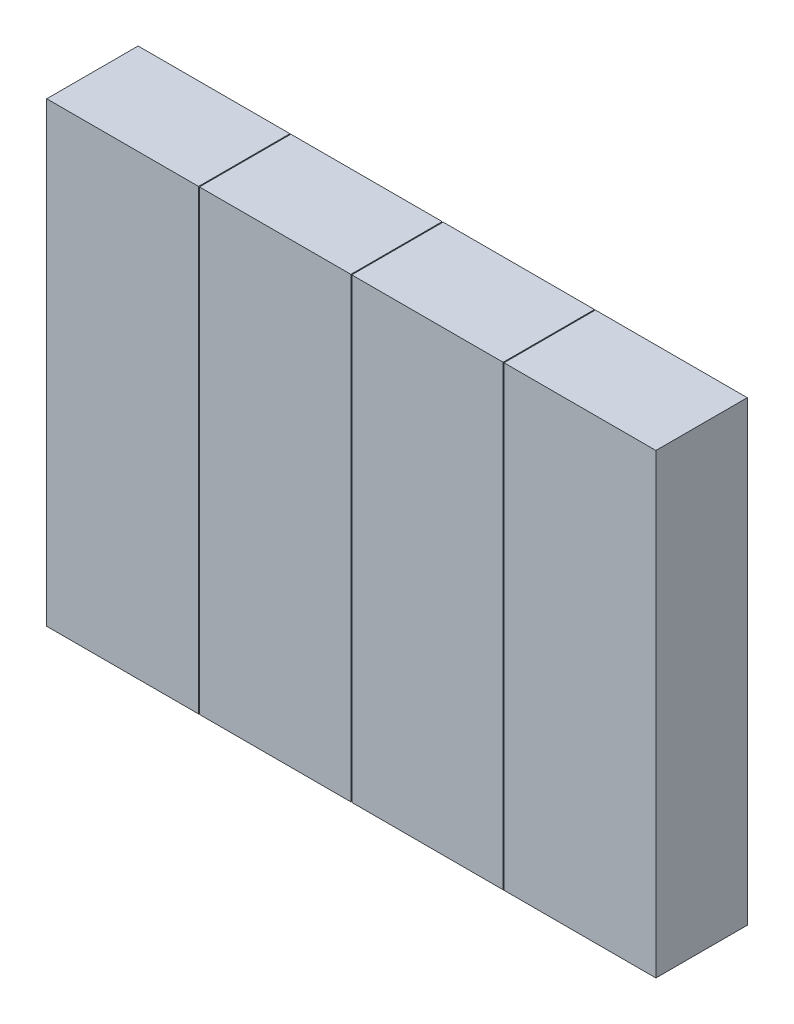
ISO-10303-21;
HEADER;
FILE_DESCRIPTION(('STEP AP214'),'2;1');
FILE_NAME('part.step','',(''),(''),'','','');
FILE_SCHEMA(('AUTOMOTIVE_DESIGN { 1 0 10303 214 1 1 1 1 }'));
ENDSEC;
DATA;
#1=APPLICATION_CONTEXT('core data for automotive mechanical design processes');
#2=APPLICATION_PROTOCOL_DEFINITION('international standard','automotive_design',2000,#1);
#3=PRODUCT_CONTEXT('',#1,'mechanical');
#4=PRODUCT('Part','Part','',(#3));
#5=PRODUCT_RELATED_PRODUCT_CATEGORY('part','',(#4));
#6=PRODUCT_DEFINITION_FORMATION('','',#4);
#7=PRODUCT_DEFINITION_CONTEXT('part definition',#1,'design');
#8=PRODUCT_DEFINITION('design','',#6,#7);
#9=PRODUCT_DEFINITION_SHAPE('','',#8);
#10=(LENGTH_UNIT() NAMED_UNIT(*) SI_UNIT(.MILLI.,.METRE.));
#11=(NAMED_UNIT(*) PLANE_ANGLE_UNIT() SI_UNIT($,.RADIAN.));
#12=(NAMED_UNIT(*) SI_UNIT($,.STERADIAN.) SOLID_ANGLE_UNIT());
#13=UNCERTAINTY_MEASURE_WITH_UNIT(LENGTH_MEASURE(1.E-05),#10,'distance_accuracy_value','');
#14=(GEOMETRIC_REPRESENTATION_CONTEXT(3) GLOBAL_UNCERTAINTY_ASSIGNED_CONTEXT((#13)) GLOBAL_UNIT_ASSIGNED_CONTEXT((#10,
#11,#12)) REPRESENTATION_CONTEXT('',''));
#15=CARTESIAN_POINT('',(0.,0.,0.));
#16=DIRECTION('',(0.,0.,1.));
#17=DIRECTION('',(1.,0.,0.));
#18=AXIS2_PLACEMENT_3D('',#15,#16,#17);
#19=CARTESIAN_POINT('',(83.3370936339227,307.82130846245,30.));
#20=DIRECTION('',(0.,-1.,0.));
#21=DIRECTION('',(0.,0.,-1.));
#22=AXIS2_PLACEMENT_3D('',#19,#20,#21);
#23=PLANE('',#22);
#24=DIRECTION('',(-1.,0.,0.));
#25=VECTOR('',#24,1.);
#26=CARTESIAN_POINT('',(83.3370936339227,307.82130846245,30.));
#27=LINE('',#26,#25);
#28=CARTESIAN_POINT('',(-66.8129063660773,307.82130846245,30.));
#29=VERTEX_POINT('',#28);
#30=CARTESIAN_POINT('',(-116.662906366077,307.82130846245,30.));
#31=VERTEX_POINT('',#30);
#32=EDGE_CURVE('E100',#29,#31,#27,.T.);
#33=ORIENTED_EDGE('',*,*,#32,.F.);
#34=DIRECTION('',(0.,0.,1.));
#35=VECTOR('',#34,1.);
#36=CARTESIAN_POINT('',(-66.8129063660773,307.82130846245,0.));
#37=LINE('',#36,#35);
#38=CARTESIAN_POINT('',(-66.8129063660773,307.82130846245,0.));
#39=VERTEX_POINT('',#38);
#40=EDGE_CURVE('E12',#39,#29,#37,.T.);
#41=ORIENTED_EDGE('',*,*,#40,.F.);
#42=DIRECTION('',(-1.,0.,0.));
#43=VECTOR('',#42,1.);
#44=CARTESIAN_POINT('',(83.3370936339227,307.82130846245,0.));
#45=LINE('',#44,#43);
#46=CARTESIAN_POINT('',(-116.662906366077,307.82130846245,0.));
#47=VERTEX_POINT('',#46);
#48=EDGE_CURVE('E96',#39,#47,#45,.T.);
#49=ORIENTED_EDGE('',*,*,#48,.T.);
#50=DIRECTION('',(0.,0.,-1.));
#51=VECTOR('',#50,1.);
#52=CARTESIAN_POINT('',(-116.662906366077,307.82130846245,30.));
#53=LINE('',#52,#51);
#54=EDGE_CURVE('E107',#31,#47,#53,.T.);
#55=ORIENTED_EDGE('',*,*,#54,.F.);
#56=EDGE_LOOP('',(#33,#41,#49,#55));
#57=FACE_BOUND('',#56,.T.);
#58=ADVANCED_FACE('F53',(#57),#23,.F.);
#59=CARTESIAN_POINT('',(83.3370936339227,157.82130846245,30.));
#60=DIRECTION('',(0.,1.,0.));
#61=DIRECTION('',(0.,0.,1.));
#62=AXIS2_PLACEMENT_3D('',#59,#60,#61);
#63=PLANE('',#62);
#64=DIRECTION('',(1.,0.,0.));
#65=VECTOR('',#64,1.);
#66=CARTESIAN_POINT('',(83.3370936339227,157.82130846245,0.));
#67=LINE('',#66,#65);
#68=CARTESIAN_POINT('',(-116.662906366077,157.82130846245,0.));
#69=VERTEX_POINT('',#68);
#70=CARTESIAN_POINT('',(-66.8129063660773,157.82130846245,0.));
#71=VERTEX_POINT('',#70);
#72=EDGE_CURVE('E121',#69,#71,#67,.T.);
#73=ORIENTED_EDGE('',*,*,#72,.T.);
#74=DIRECTION('',(0.,0.,1.));
#75=VECTOR('',#74,1.);
#76=CARTESIAN_POINT('',(-66.8129063660773,157.82130846245,0.));
#77=LINE('',#76,#75);
#78=CARTESIAN_POINT('',(-66.8129063660773,157.82130846245,30.));
#79=VERTEX_POINT('',#78);
#80=EDGE_CURVE('E119',#71,#79,#77,.T.);
#81=ORIENTED_EDGE('',*,*,#80,.T.);
#82=DIRECTION('',(1.,0.,0.));
#83=VECTOR('',#82,1.);
#84=CARTESIAN_POINT('',(83.3370936339227,157.82130846245,30.));
#85=LINE('',#84,#83);
#86=CARTESIAN_POINT('',(-116.662906366077,157.82130846245,30.));
#87=VERTEX_POINT('',#86);
#88=EDGE_CURVE('E56',#87,#79,#85,.T.);
#89=ORIENTED_EDGE('',*,*,#88,.F.);
#90=DIRECTION('',(0.,0.,-1.));
#91=VECTOR('',#90,1.);
#92=CARTESIAN_POINT('',(-116.662906366077,157.82130846245,30.));
#93=LINE('',#92,#91);
#94=EDGE_CURVE('E106',#87,#69,#93,.T.);
#95=ORIENTED_EDGE('',*,*,#94,.T.);
#96=EDGE_LOOP('',(#73,#81,#89,#95));
#97=FACE_BOUND('',#96,.T.);
#98=ADVANCED_FACE('F134',(#97),#63,.F.);
#99=CARTESIAN_POINT('',(0.,0.,30.));
#100=DIRECTION('',(0.,0.,1.));
#101=DIRECTION('',(1.,0.,0.));
#102=AXIS2_PLACEMENT_3D('',#99,#100,#101);
#103=PLANE('',#102);
#104=DIRECTION('',(0.,-1.,0.));
#105=VECTOR('',#104,1.);
#106=CARTESIAN_POINT('',(-66.8129063660773,307.82130846245,30.));
#107=LINE('',#106,#105);
#108=EDGE_CURVE('E63',#29,#79,#107,.T.);
#109=ORIENTED_EDGE('',*,*,#108,.F.);
#110=ORIENTED_EDGE('',*,*,#32,.T.);
#111=DIRECTION('',(0.,-1.,0.));
#112=VECTOR('',#111,1.);
#113=CARTESIAN_POINT('',(-116.662906366077,157.82130846245,30.));
#114=LINE('',#113,#112);
#115=EDGE_CURVE('E104',#31,#87,#114,.T.);
#116=ORIENTED_EDGE('',*,*,#115,.T.);
#117=ORIENTED_EDGE('',*,*,#88,.T.);
#118=EDGE_LOOP('',(#109,#110,#116,#117));
#119=FACE_BOUND('',#118,.T.);
#120=ADVANCED_FACE('F101',(#119),#103,.T.);
#121=CARTESIAN_POINT('',(0.,0.,0.));
#122=DIRECTION('',(0.,0.,1.));
#123=DIRECTION('',(1.,0.,0.));
#124=AXIS2_PLACEMENT_3D('',#121,#122,#123);
#125=PLANE('',#124);
#126=ORIENTED_EDGE('',*,*,#48,.F.);
#127=DIRECTION('',(0.,-1.,0.));
#128=VECTOR('',#127,1.);
#129=CARTESIAN_POINT('',(-66.8129063660773,307.82130846245,0.));
#130=LINE('',#129,#128);
#131=EDGE_CURVE('E115',#39,#71,#130,.T.);
#132=ORIENTED_EDGE('',*,*,#131,.T.);
#133=ORIENTED_EDGE('',*,*,#72,.F.);
#134=DIRECTION('',(0.,-1.,0.));
#135=VECTOR('',#134,1.);
#136=CARTESIAN_POINT('',(-116.662906366077,157.82130846245,0.));
#137=LINE('',#136,#135);
#138=EDGE_CURVE('E87',#47,#69,#137,.T.);
#139=ORIENTED_EDGE('',*,*,#138,.F.);
#140=EDGE_LOOP('',(#126,#132,#133,#139));
#141=FACE_BOUND('',#140,.T.);
#142=ADVANCED_FACE('F136',(#141),#125,.F.);
#143=CARTESIAN_POINT('',(-116.662906366077,157.82130846245,30.));
#144=DIRECTION('',(1.,0.,0.));
#145=DIRECTION('',(0.,0.,-1.));
#146=AXIS2_PLACEMENT_3D('',#143,#144,#145);
#147=PLANE('',#146);
#148=ORIENTED_EDGE('',*,*,#138,.T.);
#149=ORIENTED_EDGE('',*,*,#94,.F.);
#150=ORIENTED_EDGE('',*,*,#115,.F.);
#151=ORIENTED_EDGE('',*,*,#54,.T.);
#152=EDGE_LOOP('',(#148,#149,#150,#151));
#153=FACE_BOUND('',#152,.T.);
#154=ADVANCED_FACE('F110',(#153),#147,.F.);
#155=CARTESIAN_POINT('',(-66.8129063660773,307.82130846245,0.));
#156=DIRECTION('',(-1.,0.,0.));
#157=DIRECTION('',(0.,-1.,0.));
#158=AXIS2_PLACEMENT_3D('',#155,#156,#157);
#159=PLANE('',#158);
#160=ORIENTED_EDGE('',*,*,#108,.T.);
#161=ORIENTED_EDGE('',*,*,#80,.F.);
#162=ORIENTED_EDGE('',*,*,#131,.F.);
#163=ORIENTED_EDGE('',*,*,#40,.T.);
#164=EDGE_LOOP('',(#160,#161,#162,#163));
#165=FACE_BOUND('',#164,.T.);
#166=ADVANCED_FACE('F137',(#165),#159,.F.);
#167=CLOSED_SHELL('',(#58,#98,#120,#142,#154,#166));
#168=MANIFOLD_SOLID_BREP('B2',#167);
#169=CARTESIAN_POINT('',(0.,0.,0.));
#170=DIRECTION('',(0.,0.,1.));
#171=DIRECTION('',(1.,0.,0.));
#172=AXIS2_PLACEMENT_3D('',#169,#170,#171);
#173=PLANE('',#172);
#174=DIRECTION('',(1.,0.,0.));
#175=VECTOR('',#174,1.);
#176=CARTESIAN_POINT('',(83.3370936339227,157.82130846245,0.));
#177=LINE('',#176,#175);
#178=CARTESIAN_POINT('',(-16.5129063660773,157.82130846245,0.));
#179=VERTEX_POINT('',#178);
#180=CARTESIAN_POINT('',(33.1870936339227,157.82130846245,0.));
#181=VERTEX_POINT('',#180);
#182=EDGE_CURVE('E265',#179,#181,#177,.T.);
#183=ORIENTED_EDGE('',*,*,#182,.F.);
#184=DIRECTION('',(0.,1.,0.));
#185=VECTOR('',#184,1.);
#186=CARTESIAN_POINT('',(-16.5129063660773,307.82130846245,0.));
#187=LINE('',#186,#185);
#188=CARTESIAN_POINT('',(-16.5129063660773,307.82130846245,0.));
#189=VERTEX_POINT('',#188);
#190=EDGE_CURVE('E272',#179,#189,#187,.T.);
#191=ORIENTED_EDGE('',*,*,#190,.T.);
#192=DIRECTION('',(-1.,0.,0.));
#193=VECTOR('',#192,1.);
#194=CARTESIAN_POINT('',(83.3370936339227,307.82130846245,0.));
#195=LINE('',#194,#193);
#196=CARTESIAN_POINT('',(33.1870936339227,307.82130846245,0.));
#197=VERTEX_POINT('',#196);
#198=EDGE_CURVE('E260',#197,#189,#195,.T.);
#199=ORIENTED_EDGE('',*,*,#198,.F.);
#200=DIRECTION('',(0.,-1.,0.));
#201=VECTOR('',#200,1.);
#202=CARTESIAN_POINT('',(33.1870936339227,307.82130846245,0.));
#203=LINE('',#202,#201);
#204=EDGE_CURVE('E269',#197,#181,#203,.T.);
#205=ORIENTED_EDGE('',*,*,#204,.T.);
#206=EDGE_LOOP('',(#183,#191,#199,#205));
#207=FACE_BOUND('',#206,.T.);
#208=ADVANCED_FACE('F210',(#207),#173,.F.);
#209=CARTESIAN_POINT('',(0.,0.,30.));
#210=DIRECTION('',(0.,0.,1.));
#211=DIRECTION('',(1.,0.,0.));
#212=AXIS2_PLACEMENT_3D('',#209,#210,#211);
#213=PLANE('',#212);
#214=DIRECTION('',(0.,1.,0.));
#215=VECTOR('',#214,1.);
#216=CARTESIAN_POINT('',(-16.5129063660773,307.82130846245,30.));
#217=LINE('',#216,#215);
#218=CARTESIAN_POINT('',(-16.5129063660773,157.82130846245,30.));
#219=VERTEX_POINT('',#218);
#220=CARTESIAN_POINT('',(-16.5129063660773,307.82130846245,30.));
#221=VERTEX_POINT('',#220);
#222=EDGE_CURVE('E220',#219,#221,#217,.T.);
#223=ORIENTED_EDGE('',*,*,#222,.F.);
#224=DIRECTION('',(1.,0.,0.));
#225=VECTOR('',#224,1.);
#226=CARTESIAN_POINT('',(83.3370936339227,157.82130846245,30.));
#227=LINE('',#226,#225);
#228=CARTESIAN_POINT('',(33.1870936339227,157.82130846245,30.));
#229=VERTEX_POINT('',#228);
#230=EDGE_CURVE('E214',#219,#229,#227,.T.);
#231=ORIENTED_EDGE('',*,*,#230,.T.);
#232=DIRECTION('',(0.,-1.,0.));
#233=VECTOR('',#232,1.);
#234=CARTESIAN_POINT('',(33.1870936339227,307.82130846245,30.));
#235=LINE('',#234,#233);
#236=CARTESIAN_POINT('',(33.1870936339227,307.82130846245,30.));
#237=VERTEX_POINT('',#236);
#238=EDGE_CURVE('E261',#237,#229,#235,.T.);
#239=ORIENTED_EDGE('',*,*,#238,.F.);
#240=DIRECTION('',(-1.,0.,0.));
#241=VECTOR('',#240,1.);
#242=CARTESIAN_POINT('',(83.3370936339227,307.82130846245,30.));
#243=LINE('',#242,#241);
#244=EDGE_CURVE('E258',#237,#221,#243,.T.);
#245=ORIENTED_EDGE('',*,*,#244,.T.);
#246=EDGE_LOOP('',(#223,#231,#239,#245));
#247=FACE_BOUND('',#246,.T.);
#248=ADVANCED_FACE('F264',(#247),#213,.T.);
#249=CARTESIAN_POINT('',(83.3370936339227,157.82130846245,30.));
#250=DIRECTION('',(0.,1.,0.));
#251=DIRECTION('',(0.,0.,1.));
#252=AXIS2_PLACEMENT_3D('',#249,#250,#251);
#253=PLANE('',#252);
#254=ORIENTED_EDGE('',*,*,#230,.F.);
#255=DIRECTION('',(0.,0.,1.));
#256=VECTOR('',#255,1.);
#257=CARTESIAN_POINT('',(-16.5129063660773,157.82130846245,0.));
#258=LINE('',#257,#256);
#259=EDGE_CURVE('E51',#179,#219,#258,.T.);
#260=ORIENTED_EDGE('',*,*,#259,.F.);
#261=ORIENTED_EDGE('',*,*,#182,.T.);
#262=DIRECTION('',(0.,0.,1.));
#263=VECTOR('',#262,1.);
#264=CARTESIAN_POINT('',(33.1870936339227,157.82130846245,0.));
#265=LINE('',#264,#263);
#266=EDGE_CURVE('E268',#181,#229,#265,.T.);
#267=ORIENTED_EDGE('',*,*,#266,.T.);
#268=EDGE_LOOP('',(#254,#260,#261,#267));
#269=FACE_BOUND('',#268,.T.);
#270=ADVANCED_FACE('F283',(#269),#253,.F.);
#271=CARTESIAN_POINT('',(83.3370936339227,307.82130846245,30.));
#272=DIRECTION('',(0.,-1.,0.));
#273=DIRECTION('',(0.,0.,-1.));
#274=AXIS2_PLACEMENT_3D('',#271,#272,#273);
#275=PLANE('',#274);
#276=ORIENTED_EDGE('',*,*,#198,.T.);
#277=DIRECTION('',(0.,0.,1.));
#278=VECTOR('',#277,1.);
#279=CARTESIAN_POINT('',(-16.5129063660773,307.82130846245,0.));
#280=LINE('',#279,#278);
#281=EDGE_CURVE('E245',#189,#221,#280,.T.);
#282=ORIENTED_EDGE('',*,*,#281,.T.);
#283=ORIENTED_EDGE('',*,*,#244,.F.);
#284=DIRECTION('',(0.,0.,1.));
#285=VECTOR('',#284,1.);
#286=CARTESIAN_POINT('',(33.1870936339227,307.82130846245,0.));
#287=LINE('',#286,#285);
#288=EDGE_CURVE('E252',#197,#237,#287,.T.);
#289=ORIENTED_EDGE('',*,*,#288,.F.);
#290=EDGE_LOOP('',(#276,#282,#283,#289));
#291=FACE_BOUND('',#290,.T.);
#292=ADVANCED_FACE('F212',(#291),#275,.F.);
#293=CARTESIAN_POINT('',(33.1870936339227,307.82130846245,0.));
#294=DIRECTION('',(-1.,0.,0.));
#295=DIRECTION('',(0.,-1.,0.));
#296=AXIS2_PLACEMENT_3D('',#293,#294,#295);
#297=PLANE('',#296);
#298=ORIENTED_EDGE('',*,*,#238,.T.);
#299=ORIENTED_EDGE('',*,*,#266,.F.);
#300=ORIENTED_EDGE('',*,*,#204,.F.);
#301=ORIENTED_EDGE('',*,*,#288,.T.);
#302=EDGE_LOOP('',(#298,#299,#300,#301));
#303=FACE_BOUND('',#302,.T.);
#304=ADVANCED_FACE('F284',(#303),#297,.F.);
#305=CARTESIAN_POINT('',(-16.5129063660773,307.82130846245,0.));
#306=DIRECTION('',(1.,0.,0.));
#307=DIRECTION('',(0.,1.,0.));
#308=AXIS2_PLACEMENT_3D('',#305,#306,#307);
#309=PLANE('',#308);
#310=ORIENTED_EDGE('',*,*,#222,.T.);
#311=ORIENTED_EDGE('',*,*,#281,.F.);
#312=ORIENTED_EDGE('',*,*,#190,.F.);
#313=ORIENTED_EDGE('',*,*,#259,.T.);
#314=EDGE_LOOP('',(#310,#311,#312,#313));
#315=FACE_BOUND('',#314,.T.);
#316=ADVANCED_FACE('F247',(#315),#309,.F.);
#317=CLOSED_SHELL('',(#208,#248,#270,#292,#304,#316));
#318=MANIFOLD_SOLID_BREP('B6',#317);
#319=CARTESIAN_POINT('',(83.3370936339227,157.82130846245,30.));
#320=DIRECTION('',(-1.,0.,0.));
#321=DIRECTION('',(0.,0.,1.));
#322=AXIS2_PLACEMENT_3D('',#319,#320,#321);
#323=PLANE('',#322);
#324=DIRECTION('',(0.,1.,0.));
#325=VECTOR('',#324,1.);
#326=CARTESIAN_POINT('',(83.3370936339227,157.82130846245,0.));
#327=LINE('',#326,#325);
#328=CARTESIAN_POINT('',(83.3370936339227,157.82130846245,0.));
#329=VERTEX_POINT('',#328);
#330=CARTESIAN_POINT('',(83.3370936339227,307.82130846245,0.));
#331=VERTEX_POINT('',#330);
#332=EDGE_CURVE('E416',#329,#331,#327,.T.);
#333=ORIENTED_EDGE('',*,*,#332,.T.);
#334=DIRECTION('',(0.,0.,-1.));
#335=VECTOR('',#334,1.);
#336=CARTESIAN_POINT('',(83.3370936339227,307.82130846245,30.));
#337=LINE('',#336,#335);
#338=CARTESIAN_POINT('',(83.3370936339227,307.82130846245,30.));
#339=VERTEX_POINT('',#338);
#340=EDGE_CURVE('E395',#339,#331,#337,.T.);
#341=ORIENTED_EDGE('',*,*,#340,.F.);
#342=DIRECTION('',(0.,1.,0.));
#343=VECTOR('',#342,1.);
#344=CARTESIAN_POINT('',(83.3370936339227,157.82130846245,30.));
#345=LINE('',#344,#343);
#346=CARTESIAN_POINT('',(83.3370936339227,157.82130846245,30.));
#347=VERTEX_POINT('',#346);
#348=EDGE_CURVE('E406',#347,#339,#345,.T.);
#349=ORIENTED_EDGE('',*,*,#348,.F.);
#350=DIRECTION('',(0.,0.,-1.));
#351=VECTOR('',#350,1.);
#352=CARTESIAN_POINT('',(83.3370936339227,157.82130846245,30.));
#353=LINE('',#352,#351);
#354=EDGE_CURVE('E414',#347,#329,#353,.T.);
#355=ORIENTED_EDGE('',*,*,#354,.T.);
#356=EDGE_LOOP('',(#333,#341,#349,#355));
#357=FACE_BOUND('',#356,.T.);
#358=ADVANCED_FACE('F354',(#357),#323,.F.);
#359=CARTESIAN_POINT('',(0.,0.,0.));
#360=DIRECTION('',(0.,0.,1.));
#361=DIRECTION('',(1.,0.,0.));
#362=AXIS2_PLACEMENT_3D('',#359,#360,#361);
#363=PLANE('',#362);
#364=DIRECTION('',(1.,0.,0.));
#365=VECTOR('',#364,1.);
#366=CARTESIAN_POINT('',(83.3370936339227,157.82130846245,0.));
#367=LINE('',#366,#365);
#368=CARTESIAN_POINT('',(33.4870936339227,157.82130846245,0.));
#369=VERTEX_POINT('',#368);
#370=EDGE_CURVE('E408',#369,#329,#367,.T.);
#371=ORIENTED_EDGE('',*,*,#370,.F.);
#372=DIRECTION('',(0.,1.,0.));
#373=VECTOR('',#372,1.);
#374=CARTESIAN_POINT('',(33.4870936339227,307.82130846245,0.));
#375=LINE('',#374,#373);
#376=CARTESIAN_POINT('',(33.4870936339227,307.82130846245,0.));
#377=VERTEX_POINT('',#376);
#378=EDGE_CURVE('E413',#369,#377,#375,.T.);
#379=ORIENTED_EDGE('',*,*,#378,.T.);
#380=DIRECTION('',(-1.,0.,0.));
#381=VECTOR('',#380,1.);
#382=CARTESIAN_POINT('',(83.3370936339227,307.82130846245,0.));
#383=LINE('',#382,#381);
#384=EDGE_CURVE('E402',#331,#377,#383,.T.);
#385=ORIENTED_EDGE('',*,*,#384,.F.);
#386=ORIENTED_EDGE('',*,*,#332,.F.);
#387=EDGE_LOOP('',(#371,#379,#385,#386));
#388=FACE_BOUND('',#387,.T.);
#389=ADVANCED_FACE('F426',(#388),#363,.F.);
#390=CARTESIAN_POINT('',(0.,0.,30.));
#391=DIRECTION('',(0.,0.,1.));
#392=DIRECTION('',(1.,0.,0.));
#393=AXIS2_PLACEMENT_3D('',#390,#391,#392);
#394=PLANE('',#393);
#395=DIRECTION('',(0.,1.,0.));
#396=VECTOR('',#395,1.);
#397=CARTESIAN_POINT('',(33.4870936339227,307.82130846245,30.));
#398=LINE('',#397,#396);
#399=CARTESIAN_POINT('',(33.4870936339227,157.82130846245,30.));
#400=VERTEX_POINT('',#399);
#401=CARTESIAN_POINT('',(33.4870936339227,307.82130846245,30.));
#402=VERTEX_POINT('',#401);
#403=EDGE_CURVE('E364',#400,#402,#398,.T.);
#404=ORIENTED_EDGE('',*,*,#403,.F.);
#405=DIRECTION('',(1.,0.,0.));
#406=VECTOR('',#405,1.);
#407=CARTESIAN_POINT('',(83.3370936339227,157.82130846245,30.));
#408=LINE('',#407,#406);
#409=EDGE_CURVE('E358',#400,#347,#408,.T.);
#410=ORIENTED_EDGE('',*,*,#409,.T.);
#411=ORIENTED_EDGE('',*,*,#348,.T.);
#412=DIRECTION('',(-1.,0.,0.));
#413=VECTOR('',#412,1.);
#414=CARTESIAN_POINT('',(83.3370936339227,307.82130846245,30.));
#415=LINE('',#414,#413);
#416=EDGE_CURVE('E400',#339,#402,#415,.T.);
#417=ORIENTED_EDGE('',*,*,#416,.T.);
#418=EDGE_LOOP('',(#404,#410,#411,#417));
#419=FACE_BOUND('',#418,.T.);
#420=ADVANCED_FACE('F404',(#419),#394,.T.);
#421=CARTESIAN_POINT('',(83.3370936339227,157.82130846245,30.));
#422=DIRECTION('',(0.,1.,0.));
#423=DIRECTION('',(0.,0.,1.));
#424=AXIS2_PLACEMENT_3D('',#421,#422,#423);
#425=PLANE('',#424);
#426=ORIENTED_EDGE('',*,*,#409,.F.);
#427=DIRECTION('',(0.,0.,1.));
#428=VECTOR('',#427,1.);
#429=CARTESIAN_POINT('',(33.4870936339227,157.82130846245,0.));
#430=LINE('',#429,#428);
#431=EDGE_CURVE('E208',#369,#400,#430,.T.);
#432=ORIENTED_EDGE('',*,*,#431,.F.);
#433=ORIENTED_EDGE('',*,*,#370,.T.);
#434=ORIENTED_EDGE('',*,*,#354,.F.);
#435=EDGE_LOOP('',(#426,#432,#433,#434));
#436=FACE_BOUND('',#435,.T.);
#437=ADVANCED_FACE('F428',(#436),#425,.F.);
#438=CARTESIAN_POINT('',(83.3370936339227,307.82130846245,30.));
#439=DIRECTION('',(0.,-1.,0.));
#440=DIRECTION('',(0.,0.,-1.));
#441=AXIS2_PLACEMENT_3D('',#438,#439,#440);
#442=PLANE('',#441);
#443=ORIENTED_EDGE('',*,*,#384,.T.);
#444=DIRECTION('',(0.,0.,1.));
#445=VECTOR('',#444,1.);
#446=CARTESIAN_POINT('',(33.4870936339227,307.82130846245,0.));
#447=LINE('',#446,#445);
#448=EDGE_CURVE('E389',#377,#402,#447,.T.);
#449=ORIENTED_EDGE('',*,*,#448,.T.);
#450=ORIENTED_EDGE('',*,*,#416,.F.);
#451=ORIENTED_EDGE('',*,*,#340,.T.);
#452=EDGE_LOOP('',(#443,#449,#450,#451));
#453=FACE_BOUND('',#452,.T.);
#454=ADVANCED_FACE('F356',(#453),#442,.F.);
#455=CARTESIAN_POINT('',(33.4870936339227,307.82130846245,0.));
#456=DIRECTION('',(1.,0.,0.));
#457=DIRECTION('',(0.,1.,0.));
#458=AXIS2_PLACEMENT_3D('',#455,#456,#457);
#459=PLANE('',#458);
#460=ORIENTED_EDGE('',*,*,#403,.T.);
#461=ORIENTED_EDGE('',*,*,#448,.F.);
#462=ORIENTED_EDGE('',*,*,#378,.F.);
#463=ORIENTED_EDGE('',*,*,#431,.T.);
#464=EDGE_LOOP('',(#460,#461,#462,#463));
#465=FACE_BOUND('',#464,.T.);
#466=ADVANCED_FACE('F391',(#465),#459,.F.);
#467=CLOSED_SHELL('',(#358,#389,#420,#437,#454,#466));
#468=MANIFOLD_SOLID_BREP('B45',#467);
#469=CARTESIAN_POINT('',(0.,0.,0.));
#470=DIRECTION('',(0.,0.,1.));
#471=DIRECTION('',(1.,0.,0.));
#472=AXIS2_PLACEMENT_3D('',#469,#470,#471);
#473=PLANE('',#472);
#474=DIRECTION('',(1.,0.,0.));
#475=VECTOR('',#474,1.);
#476=CARTESIAN_POINT('',(83.3370936339227,157.82130846245,0.));
#477=LINE('',#476,#475);
#478=CARTESIAN_POINT('',(-66.5129063660773,157.82130846245,0.));
#479=VERTEX_POINT('',#478);
#480=CARTESIAN_POINT('',(-16.8129063660773,157.82130846245,0.));
#481=VERTEX_POINT('',#480);
#482=EDGE_CURVE('E493',#479,#481,#477,.T.);
#483=ORIENTED_EDGE('',*,*,#482,.F.);
#484=DIRECTION('',(0.,1.,0.));
#485=VECTOR('',#484,1.);
#486=CARTESIAN_POINT('',(-66.5129063660773,307.82130846245,0.));
#487=LINE('',#486,#485);
#488=CARTESIAN_POINT('',(-66.5129063660773,307.82130846245,0.));
#489=VERTEX_POINT('',#488);
#490=EDGE_CURVE('E534',#479,#489,#487,.T.);
#491=ORIENTED_EDGE('',*,*,#490,.T.);
#492=DIRECTION('',(-1.,0.,0.));
#493=VECTOR('',#492,1.);
#494=CARTESIAN_POINT('',(83.3370936339227,307.82130846245,0.));
#495=LINE('',#494,#493);
#496=CARTESIAN_POINT('',(-16.8129063660773,307.82130846245,0.));
#497=VERTEX_POINT('',#496);
#498=EDGE_CURVE('E555',#497,#489,#495,.T.);
#499=ORIENTED_EDGE('',*,*,#498,.F.);
#500=DIRECTION('',(0.,-1.,0.));
#501=VECTOR('',#500,1.);
#502=CARTESIAN_POINT('',(-16.8129063660773,307.82130846245,0.));
#503=LINE('',#502,#501);
#504=EDGE_CURVE('E550',#497,#481,#503,.T.);
#505=ORIENTED_EDGE('',*,*,#504,.T.);
#506=EDGE_LOOP('',(#483,#491,#499,#505));
#507=FACE_BOUND('',#506,.T.);
#508=ADVANCED_FACE('F489',(#507),#473,.F.);
#509=CARTESIAN_POINT('',(0.,0.,30.));
#510=DIRECTION('',(0.,0.,1.));
#511=DIRECTION('',(1.,0.,0.));
#512=AXIS2_PLACEMENT_3D('',#509,#510,#511);
#513=PLANE('',#512);
#514=DIRECTION('',(0.,1.,0.));
#515=VECTOR('',#514,1.);
#516=CARTESIAN_POINT('',(-66.5129063660773,307.82130846245,30.));
#517=LINE('',#516,#515);
#518=CARTESIAN_POINT('',(-66.5129063660773,157.82130846245,30.));
#519=VERTEX_POINT('',#518);
#520=CARTESIAN_POINT('',(-66.5129063660773,307.82130846245,30.));
#521=VERTEX_POINT('',#520);
#522=EDGE_CURVE('E533',#519,#521,#517,.T.);
#523=ORIENTED_EDGE('',*,*,#522,.F.);
#524=DIRECTION('',(1.,0.,0.));
#525=VECTOR('',#524,1.);
#526=CARTESIAN_POINT('',(83.3370936339227,157.82130846245,30.));
#527=LINE('',#526,#525);
#528=CARTESIAN_POINT('',(-16.8129063660773,157.82130846245,30.));
#529=VERTEX_POINT('',#528);
#530=EDGE_CURVE('E352',#519,#529,#527,.T.);
#531=ORIENTED_EDGE('',*,*,#530,.T.);
#532=DIRECTION('',(0.,-1.,0.));
#533=VECTOR('',#532,1.);
#534=CARTESIAN_POINT('',(-16.8129063660773,307.82130846245,30.));
#535=LINE('',#534,#533);
#536=CARTESIAN_POINT('',(-16.8129063660773,307.82130846245,30.));
#537=VERTEX_POINT('',#536);
#538=EDGE_CURVE('E545',#537,#529,#535,.T.);
#539=ORIENTED_EDGE('',*,*,#538,.F.);
#540=DIRECTION('',(-1.,0.,0.));
#541=VECTOR('',#540,1.);
#542=CARTESIAN_POINT('',(83.3370936339227,307.82130846245,30.));
#543=LINE('',#542,#541);
#544=EDGE_CURVE('E498',#537,#521,#543,.T.);
#545=ORIENTED_EDGE('',*,*,#544,.T.);
#546=EDGE_LOOP('',(#523,#531,#539,#545));
#547=FACE_BOUND('',#546,.T.);
#548=ADVANCED_FACE('F542',(#547),#513,.T.);
#549=CARTESIAN_POINT('',(83.3370936339227,157.82130846245,30.));
#550=DIRECTION('',(0.,1.,0.));
#551=DIRECTION('',(0.,0.,1.));
#552=AXIS2_PLACEMENT_3D('',#549,#550,#551);
#553=PLANE('',#552);
#554=ORIENTED_EDGE('',*,*,#530,.F.);
#555=DIRECTION('',(0.,0.,1.));
#556=VECTOR('',#555,1.);
#557=CARTESIAN_POINT('',(-66.5129063660773,157.82130846245,0.));
#558=LINE('',#557,#556);
#559=EDGE_CURVE('E530',#479,#519,#558,.T.);
#560=ORIENTED_EDGE('',*,*,#559,.F.);
#561=ORIENTED_EDGE('',*,*,#482,.T.);
#562=DIRECTION('',(0.,0.,1.));
#563=VECTOR('',#562,1.);
#564=CARTESIAN_POINT('',(-16.8129063660773,157.82130846245,0.));
#565=LINE('',#564,#563);
#566=EDGE_CURVE('E514',#481,#529,#565,.T.);
#567=ORIENTED_EDGE('',*,*,#566,.T.);
#568=EDGE_LOOP('',(#554,#560,#561,#567));
#569=FACE_BOUND('',#568,.T.);
#570=ADVANCED_FACE('F547',(#569),#553,.F.);
#571=CARTESIAN_POINT('',(83.3370936339227,307.82130846245,30.));
#572=DIRECTION('',(0.,-1.,0.));
#573=DIRECTION('',(0.,0.,-1.));
#574=AXIS2_PLACEMENT_3D('',#571,#572,#573);
#575=PLANE('',#574);
#576=ORIENTED_EDGE('',*,*,#498,.T.);
#577=DIRECTION('',(0.,0.,1.));
#578=VECTOR('',#577,1.);
#579=CARTESIAN_POINT('',(-66.5129063660773,307.82130846245,0.));
#580=LINE('',#579,#578);
#581=EDGE_CURVE('E506',#489,#521,#580,.T.);
#582=ORIENTED_EDGE('',*,*,#581,.T.);
#583=ORIENTED_EDGE('',*,*,#544,.F.);
#584=DIRECTION('',(0.,0.,1.));
#585=VECTOR('',#584,1.);
#586=CARTESIAN_POINT('',(-16.8129063660773,307.82130846245,0.));
#587=LINE('',#586,#585);
#588=EDGE_CURVE('E548',#497,#537,#587,.T.);
#589=ORIENTED_EDGE('',*,*,#588,.F.);
#590=EDGE_LOOP('',(#576,#582,#583,#589));
#591=FACE_BOUND('',#590,.T.);
#592=ADVANCED_FACE('F491',(#591),#575,.F.);
#593=CARTESIAN_POINT('',(-16.8129063660773,307.82130846245,0.));
#594=DIRECTION('',(-1.,0.,0.));
#595=DIRECTION('',(0.,-1.,0.));
#596=AXIS2_PLACEMENT_3D('',#593,#594,#595);
#597=PLANE('',#596);
#598=ORIENTED_EDGE('',*,*,#538,.T.);
#599=ORIENTED_EDGE('',*,*,#566,.F.);
#600=ORIENTED_EDGE('',*,*,#504,.F.);
#601=ORIENTED_EDGE('',*,*,#588,.T.);
#602=EDGE_LOOP('',(#598,#599,#600,#601));
#603=FACE_BOUND('',#602,.T.);
#604=ADVANCED_FACE('F563',(#603),#597,.F.);
#605=CARTESIAN_POINT('',(-66.5129063660773,307.82130846245,0.));
#606=DIRECTION('',(1.,0.,0.));
#607=DIRECTION('',(0.,1.,0.));
#608=AXIS2_PLACEMENT_3D('',#605,#606,#607);
#609=PLANE('',#608);
#610=ORIENTED_EDGE('',*,*,#522,.T.);
#611=ORIENTED_EDGE('',*,*,#581,.F.);
#612=ORIENTED_EDGE('',*,*,#490,.F.);
#613=ORIENTED_EDGE('',*,*,#559,.T.);
#614=EDGE_LOOP('',(#610,#611,#612,#613));
#615=FACE_BOUND('',#614,.T.);
#616=ADVANCED_FACE('F532',(#615),#609,.F.);
#617=CLOSED_SHELL('',(#508,#548,#570,#592,#604,#616));
#618=MANIFOLD_SOLID_BREP('B202',#617);
#619=ADVANCED_BREP_SHAPE_REPRESENTATION('',(#18,#168,#318,#468,#618),#14);
#620=SHAPE_DEFINITION_REPRESENTATION(#9,#619);
ENDSEC;
END-ISO-10303-21;
